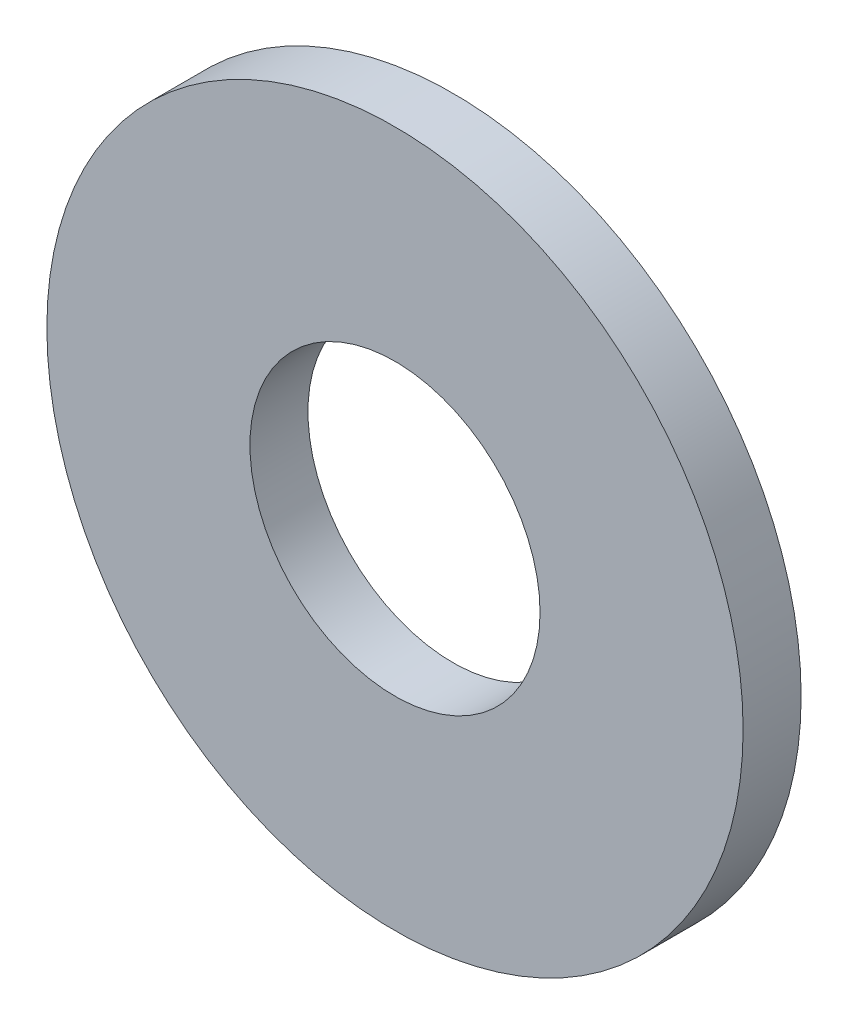
ISO-10303-21;
HEADER;
FILE_DESCRIPTION(('STEP AP214'),'2;1');
FILE_NAME('part.step','',(''),(''),'','','');
FILE_SCHEMA(('AUTOMOTIVE_DESIGN { 1 0 10303 214 1 1 1 1 }'));
ENDSEC;
DATA;
#1=APPLICATION_CONTEXT('core data for automotive mechanical design processes');
#2=APPLICATION_PROTOCOL_DEFINITION('international standard','automotive_design',2000,#1);
#3=PRODUCT_CONTEXT('',#1,'mechanical');
#4=PRODUCT('Part','Part','',(#3));
#5=PRODUCT_RELATED_PRODUCT_CATEGORY('part','',(#4));
#6=PRODUCT_DEFINITION_FORMATION('','',#4);
#7=PRODUCT_DEFINITION_CONTEXT('part definition',#1,'design');
#8=PRODUCT_DEFINITION('design','',#6,#7);
#9=PRODUCT_DEFINITION_SHAPE('','',#8);
#10=(LENGTH_UNIT() NAMED_UNIT(*) SI_UNIT(.MILLI.,.METRE.));
#11=(NAMED_UNIT(*) PLANE_ANGLE_UNIT() SI_UNIT($,.RADIAN.));
#12=(NAMED_UNIT(*) SI_UNIT($,.STERADIAN.) SOLID_ANGLE_UNIT());
#13=UNCERTAINTY_MEASURE_WITH_UNIT(LENGTH_MEASURE(1.E-05),#10,'distance_accuracy_value','');
#14=(GEOMETRIC_REPRESENTATION_CONTEXT(3) GLOBAL_UNCERTAINTY_ASSIGNED_CONTEXT((#13)) GLOBAL_UNIT_ASSIGNED_CONTEXT((#10,
#11,#12)) REPRESENTATION_CONTEXT('',''));
#15=CARTESIAN_POINT('',(0.,0.,0.));
#16=DIRECTION('',(0.,0.,1.));
#17=DIRECTION('',(1.,0.,0.));
#18=AXIS2_PLACEMENT_3D('',#15,#16,#17);
#19=CARTESIAN_POINT('',(0.,0.,0.79375));
#20=DIRECTION('',(0.,0.,1.));
#21=DIRECTION('',(1.,0.,0.));
#22=AXIS2_PLACEMENT_3D('',#19,#20,#21);
#23=PLANE('',#22);
#24=CARTESIAN_POINT('',(0.,0.,0.79375));
#25=DIRECTION('',(0.,0.,1.));
#26=DIRECTION('',(1.,0.,0.));
#27=AXIS2_PLACEMENT_3D('',#24,#25,#26);
#28=CIRCLE('',#27,9.525);
#29=CARTESIAN_POINT('',(9.525,0.,0.79375));
#30=VERTEX_POINT('',#29);
#31=EDGE_CURVE('E10',#30,#30,#28,.T.);
#32=ORIENTED_EDGE('',*,*,#31,.T.);
#33=EDGE_LOOP('',(#32));
#34=FACE_BOUND('',#33,.T.);
#35=CARTESIAN_POINT('',(0.,0.,0.79375));
#36=DIRECTION('',(0.,0.,1.));
#37=DIRECTION('',(1.,0.,0.));
#38=AXIS2_PLACEMENT_3D('',#35,#36,#37);
#39=CIRCLE('',#38,3.96875);
#40=CARTESIAN_POINT('',(3.96875,0.,0.79375));
#41=VERTEX_POINT('',#40);
#42=EDGE_CURVE('E44',#41,#41,#39,.T.);
#43=ORIENTED_EDGE('',*,*,#42,.F.);
#44=EDGE_LOOP('',(#43));
#45=FACE_BOUND('',#44,.T.);
#46=ADVANCED_FACE('F33',(#34,#45),#23,.T.);
#47=CARTESIAN_POINT('',(0.,0.,-0.79375));
#48=DIRECTION('',(0.,0.,1.));
#49=DIRECTION('',(1.,0.,0.));
#50=AXIS2_PLACEMENT_3D('',#47,#48,#49);
#51=PLANE('',#50);
#52=CARTESIAN_POINT('',(0.,0.,-0.79375));
#53=DIRECTION('',(0.,0.,1.));
#54=DIRECTION('',(1.,0.,0.));
#55=AXIS2_PLACEMENT_3D('',#52,#53,#54);
#56=CIRCLE('',#55,9.525);
#57=CARTESIAN_POINT('',(9.525,0.,-0.79375));
#58=VERTEX_POINT('',#57);
#59=EDGE_CURVE('E37',#58,#58,#56,.T.);
#60=ORIENTED_EDGE('',*,*,#59,.F.);
#61=EDGE_LOOP('',(#60));
#62=FACE_BOUND('',#61,.T.);
#63=CARTESIAN_POINT('',(0.,0.,-0.79375));
#64=DIRECTION('',(0.,0.,1.));
#65=DIRECTION('',(1.,0.,0.));
#66=AXIS2_PLACEMENT_3D('',#63,#64,#65);
#67=CIRCLE('',#66,3.96875);
#68=CARTESIAN_POINT('',(3.96875,0.,-0.79375));
#69=VERTEX_POINT('',#68);
#70=EDGE_CURVE('E46',#69,#69,#67,.T.);
#71=ORIENTED_EDGE('',*,*,#70,.T.);
#72=EDGE_LOOP('',(#71));
#73=FACE_BOUND('',#72,.T.);
#74=ADVANCED_FACE('F56',(#62,#73),#51,.F.);
#75=CARTESIAN_POINT('',(0.,0.,0.79375));
#76=DIRECTION('',(0.,0.,-1.));
#77=DIRECTION('',(-1.,0.,0.));
#78=AXIS2_PLACEMENT_3D('',#75,#76,#77);
#79=CYLINDRICAL_SURFACE('',#78,9.525);
#80=ORIENTED_EDGE('',*,*,#31,.F.);
#81=EDGE_LOOP('',(#80));
#82=FACE_BOUND('',#81,.T.);
#83=ORIENTED_EDGE('',*,*,#59,.T.);
#84=EDGE_LOOP('',(#83));
#85=FACE_BOUND('',#84,.T.);
#86=ADVANCED_FACE('F35',(#82,#85),#79,.T.);
#87=CARTESIAN_POINT('',(0.,0.,0.79375));
#88=DIRECTION('',(0.,0.,-1.));
#89=DIRECTION('',(-1.,0.,0.));
#90=AXIS2_PLACEMENT_3D('',#87,#88,#89);
#91=CYLINDRICAL_SURFACE('',#90,3.96875);
#92=ORIENTED_EDGE('',*,*,#42,.T.);
#93=EDGE_LOOP('',(#92));
#94=FACE_BOUND('',#93,.T.);
#95=ORIENTED_EDGE('',*,*,#70,.F.);
#96=EDGE_LOOP('',(#95));
#97=FACE_BOUND('',#96,.T.);
#98=ADVANCED_FACE('F52',(#94,#97),#91,.F.);
#99=CLOSED_SHELL('',(#46,#74,#86,#98));
#100=MANIFOLD_SOLID_BREP('B2',#99);
#101=ADVANCED_BREP_SHAPE_REPRESENTATION('',(#18,#100),#14);
#102=SHAPE_DEFINITION_REPRESENTATION(#9,#101);
ENDSEC;
END-ISO-10303-21;
